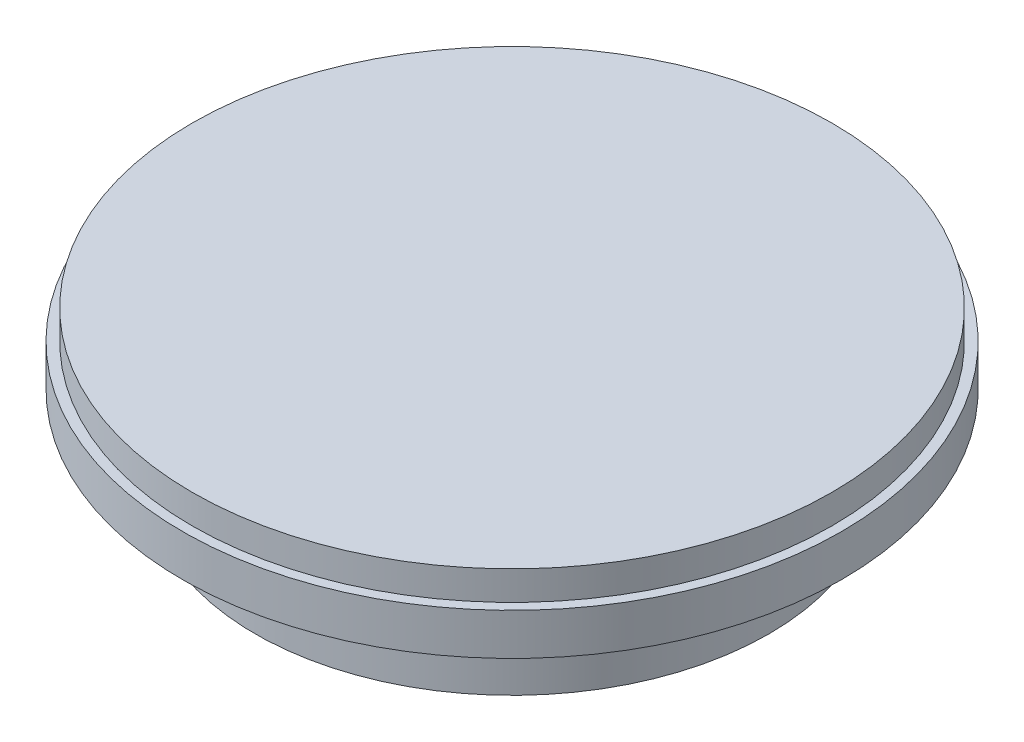
ISO-10303-21;
HEADER;
FILE_DESCRIPTION(('STEP AP214'),'2;1');
FILE_NAME('part.step','',(''),(''),'','','');
FILE_SCHEMA(('AUTOMOTIVE_DESIGN { 1 0 10303 214 1 1 1 1 }'));
ENDSEC;
DATA;
#1=APPLICATION_CONTEXT('core data for automotive mechanical design processes');
#2=APPLICATION_PROTOCOL_DEFINITION('international standard','automotive_design',2000,#1);
#3=PRODUCT_CONTEXT('',#1,'mechanical');
#4=PRODUCT('Part','Part','',(#3));
#5=PRODUCT_RELATED_PRODUCT_CATEGORY('part','',(#4));
#6=PRODUCT_DEFINITION_FORMATION('','',#4);
#7=PRODUCT_DEFINITION_CONTEXT('part definition',#1,'design');
#8=PRODUCT_DEFINITION('design','',#6,#7);
#9=PRODUCT_DEFINITION_SHAPE('','',#8);
#10=(LENGTH_UNIT() NAMED_UNIT(*) SI_UNIT(.MILLI.,.METRE.));
#11=(NAMED_UNIT(*) PLANE_ANGLE_UNIT() SI_UNIT($,.RADIAN.));
#12=(NAMED_UNIT(*) SI_UNIT($,.STERADIAN.) SOLID_ANGLE_UNIT());
#13=UNCERTAINTY_MEASURE_WITH_UNIT(LENGTH_MEASURE(1.E-05),#10,'distance_accuracy_value','');
#14=(GEOMETRIC_REPRESENTATION_CONTEXT(3) GLOBAL_UNCERTAINTY_ASSIGNED_CONTEXT((#13)) GLOBAL_UNIT_ASSIGNED_CONTEXT((#10,
#11,#12)) REPRESENTATION_CONTEXT('',''));
#15=CARTESIAN_POINT('',(0.,0.,0.));
#16=DIRECTION('',(0.,0.,1.));
#17=DIRECTION('',(1.,0.,0.));
#18=AXIS2_PLACEMENT_3D('',#15,#16,#17);
#19=CARTESIAN_POINT('',(0.,-0.849999999999997,0.));
#20=DIRECTION('',(0.,1.,0.));
#21=DIRECTION('',(-1.,0.,0.));
#22=AXIS2_PLACEMENT_3D('',#19,#20,#21);
#23=CONICAL_SURFACE('',#22,26.5,1.19028994968253);
#24=CARTESIAN_POINT('',(0.,2.15,0.));
#25=DIRECTION('',(0.,-1.,0.));
#26=DIRECTION('',(1.,0.,0.));
#27=AXIS2_PLACEMENT_3D('',#24,#25,#26);
#28=CIRCLE('',#27,34.);
#29=CARTESIAN_POINT('',(34.,2.15,0.));
#30=VERTEX_POINT('',#29);
#31=EDGE_CURVE('E41',#30,#30,#28,.T.);
#32=ORIENTED_EDGE('',*,*,#31,.T.);
#33=EDGE_LOOP('',(#32));
#34=FACE_BOUND('',#33,.T.);
#35=CARTESIAN_POINT('',(0.,-0.849999999999997,0.));
#36=DIRECTION('',(0.,-1.,0.));
#37=DIRECTION('',(1.,0.,0.));
#38=AXIS2_PLACEMENT_3D('',#35,#36,#37);
#39=CIRCLE('',#38,26.5);
#40=CARTESIAN_POINT('',(26.5,-0.849999999999999,0.));
#41=VERTEX_POINT('',#40);
#42=EDGE_CURVE('E94',#41,#41,#39,.T.);
#43=ORIENTED_EDGE('',*,*,#42,.F.);
#44=EDGE_LOOP('',(#43));
#45=FACE_BOUND('',#44,.T.);
#46=ADVANCED_FACE('F38',(#34,#45),#23,.T.);
#47=CARTESIAN_POINT('',(0.,-6.45,0.));
#48=DIRECTION('',(0.,-1.,0.));
#49=DIRECTION('',(1.,0.,0.));
#50=AXIS2_PLACEMENT_3D('',#47,#48,#49);
#51=CYLINDRICAL_SURFACE('',#50,34.);
#52=CARTESIAN_POINT('',(0.,6.45,0.));
#53=DIRECTION('',(0.,-1.,0.));
#54=DIRECTION('',(1.,0.,0.));
#55=AXIS2_PLACEMENT_3D('',#52,#53,#54);
#56=CIRCLE('',#55,34.);
#57=CARTESIAN_POINT('',(34.,6.45,0.));
#58=VERTEX_POINT('',#57);
#59=EDGE_CURVE('E100',#58,#58,#56,.T.);
#60=ORIENTED_EDGE('',*,*,#59,.T.);
#61=EDGE_LOOP('',(#60));
#62=FACE_BOUND('',#61,.T.);
#63=ORIENTED_EDGE('',*,*,#31,.F.);
#64=EDGE_LOOP('',(#63));
#65=FACE_BOUND('',#64,.T.);
#66=ADVANCED_FACE('F109',(#62,#65),#51,.T.);
#67=CARTESIAN_POINT('',(0.,6.45,0.));
#68=DIRECTION('',(0.,1.,0.));
#69=DIRECTION('',(-1.,0.,0.));
#70=AXIS2_PLACEMENT_3D('',#67,#68,#69);
#71=PLANE('',#70);
#72=CARTESIAN_POINT('',(0.,6.45,0.));
#73=DIRECTION('',(0.,1.,0.));
#74=DIRECTION('',(-1.,0.,0.));
#75=AXIS2_PLACEMENT_3D('',#72,#73,#74);
#76=CIRCLE('',#75,33.);
#77=CARTESIAN_POINT('',(-33.,6.45000000000001,0.));
#78=VERTEX_POINT('',#77);
#79=EDGE_CURVE('E11',#78,#78,#76,.T.);
#80=ORIENTED_EDGE('',*,*,#79,.F.);
#81=EDGE_LOOP('',(#80));
#82=FACE_BOUND('',#81,.T.);
#83=ORIENTED_EDGE('',*,*,#59,.F.);
#84=EDGE_LOOP('',(#83));
#85=FACE_BOUND('',#84,.T.);
#86=ADVANCED_FACE('F111',(#82,#85),#71,.T.);
#87=CARTESIAN_POINT('',(0.,-6.45,0.));
#88=DIRECTION('',(0.,-1.,0.));
#89=DIRECTION('',(1.,0.,0.));
#90=AXIS2_PLACEMENT_3D('',#87,#88,#89);
#91=PLANE('',#90);
#92=CARTESIAN_POINT('',(-10.6066017177982,-6.45,10.6066017177982));
#93=DIRECTION('',(0.,-1.,0.));
#94=DIRECTION('',(0.,0.,-1.));
#95=AXIS2_PLACEMENT_3D('',#92,#93,#94);
#96=CIRCLE('',#95,1.24999999999999);
#97=CARTESIAN_POINT('',(-10.6066017177982,-6.45,9.35660171779824));
#98=VERTEX_POINT('',#97);
#99=EDGE_CURVE('E70',#98,#98,#96,.T.);
#100=ORIENTED_EDGE('',*,*,#99,.F.);
#101=EDGE_LOOP('',(#100));
#102=FACE_BOUND('',#101,.T.);
#103=CARTESIAN_POINT('',(10.6066017177982,-6.45,10.6066017177982));
#104=DIRECTION('',(0.,-1.,0.));
#105=DIRECTION('',(0.,0.,-1.));
#106=AXIS2_PLACEMENT_3D('',#103,#104,#105);
#107=CIRCLE('',#106,1.24999999999999);
#108=CARTESIAN_POINT('',(10.6066017177982,-6.45,9.3566017177982));
#109=VERTEX_POINT('',#108);
#110=EDGE_CURVE('E69',#109,#109,#107,.T.);
#111=ORIENTED_EDGE('',*,*,#110,.F.);
#112=EDGE_LOOP('',(#111));
#113=FACE_BOUND('',#112,.T.);
#114=CARTESIAN_POINT('',(10.6066017177982,-6.45,-10.6066017177982));
#115=DIRECTION('',(0.,-1.,0.));
#116=DIRECTION('',(0.,0.,-1.));
#117=AXIS2_PLACEMENT_3D('',#114,#115,#116);
#118=CIRCLE('',#117,1.24999999999999);
#119=CARTESIAN_POINT('',(10.6066017177982,-6.45,-11.8566017177982));
#120=VERTEX_POINT('',#119);
#121=EDGE_CURVE('E80',#120,#120,#118,.T.);
#122=ORIENTED_EDGE('',*,*,#121,.F.);
#123=EDGE_LOOP('',(#122));
#124=FACE_BOUND('',#123,.T.);
#125=CARTESIAN_POINT('',(-10.6066017177982,-6.45,-10.6066017177982));
#126=DIRECTION('',(0.,-1.,0.));
#127=DIRECTION('',(0.,0.,-1.));
#128=AXIS2_PLACEMENT_3D('',#125,#126,#127);
#129=CIRCLE('',#128,1.24999999999999);
#130=CARTESIAN_POINT('',(-10.6066017177982,-6.45,-11.8566017177982));
#131=VERTEX_POINT('',#130);
#132=EDGE_CURVE('E86',#131,#131,#129,.T.);
#133=ORIENTED_EDGE('',*,*,#132,.F.);
#134=EDGE_LOOP('',(#133));
#135=FACE_BOUND('',#134,.T.);
#136=CARTESIAN_POINT('',(0.,-6.45,0.));
#137=DIRECTION('',(0.,-1.,0.));
#138=DIRECTION('',(1.,0.,0.));
#139=AXIS2_PLACEMENT_3D('',#136,#137,#138);
#140=CIRCLE('',#139,26.5);
#141=CARTESIAN_POINT('',(26.5,-6.45,0.));
#142=VERTEX_POINT('',#141);
#143=EDGE_CURVE('E98',#142,#142,#140,.T.);
#144=ORIENTED_EDGE('',*,*,#143,.T.);
#145=EDGE_LOOP('',(#144));
#146=FACE_BOUND('',#145,.T.);
#147=ADVANCED_FACE('F116',(#102,#113,#124,#135,#146),#91,.T.);
#148=CARTESIAN_POINT('',(0.,-6.45,0.));
#149=DIRECTION('',(0.,-1.,0.));
#150=DIRECTION('',(1.,0.,0.));
#151=AXIS2_PLACEMENT_3D('',#148,#149,#150);
#152=CYLINDRICAL_SURFACE('',#151,26.5);
#153=ORIENTED_EDGE('',*,*,#42,.T.);
#154=EDGE_LOOP('',(#153));
#155=FACE_BOUND('',#154,.T.);
#156=ORIENTED_EDGE('',*,*,#143,.F.);
#157=EDGE_LOOP('',(#156));
#158=FACE_BOUND('',#157,.T.);
#159=ADVANCED_FACE('F122',(#155,#158),#152,.T.);
#160=CARTESIAN_POINT('',(0.,9.45,0.));
#161=DIRECTION('',(0.,-1.,0.));
#162=DIRECTION('',(1.,0.,0.));
#163=AXIS2_PLACEMENT_3D('',#160,#161,#162);
#164=CYLINDRICAL_SURFACE('',#163,33.);
#165=CARTESIAN_POINT('',(0.,9.45,0.));
#166=DIRECTION('',(0.,1.,0.));
#167=DIRECTION('',(-1.,0.,0.));
#168=AXIS2_PLACEMENT_3D('',#165,#166,#167);
#169=CIRCLE('',#168,33.);
#170=CARTESIAN_POINT('',(-33.,9.45,0.));
#171=VERTEX_POINT('',#170);
#172=EDGE_CURVE('E92',#171,#171,#169,.T.);
#173=ORIENTED_EDGE('',*,*,#172,.F.);
#174=EDGE_LOOP('',(#173));
#175=FACE_BOUND('',#174,.T.);
#176=ORIENTED_EDGE('',*,*,#79,.T.);
#177=EDGE_LOOP('',(#176));
#178=FACE_BOUND('',#177,.T.);
#179=ADVANCED_FACE('F126',(#175,#178),#164,.T.);
#180=CARTESIAN_POINT('',(0.,9.45,0.));
#181=DIRECTION('',(0.,1.,0.));
#182=DIRECTION('',(-1.,0.,0.));
#183=AXIS2_PLACEMENT_3D('',#180,#181,#182);
#184=PLANE('',#183);
#185=ORIENTED_EDGE('',*,*,#172,.T.);
#186=EDGE_LOOP('',(#185));
#187=FACE_BOUND('',#186,.T.);
#188=ADVANCED_FACE('F130',(#187),#184,.T.);
#189=CARTESIAN_POINT('',(-10.6066017177982,1.05,-10.6066017177982));
#190=DIRECTION('',(0.,-1.,0.));
#191=DIRECTION('',(0.,0.,-1.));
#192=AXIS2_PLACEMENT_3D('',#189,#190,#191);
#193=CONICAL_SURFACE('',#192,1.24999999999999,1.02974425867664);
#194=CARTESIAN_POINT('',(-10.6066017177982,1.80107577378445,-10.6066017177982));
#195=VERTEX_POINT('',#194);
#196=VERTEX_LOOP('',#195);
#197=FACE_BOUND('',#196,.T.);
#198=CARTESIAN_POINT('',(-10.6066017177982,1.05,-10.6066017177982));
#199=DIRECTION('',(0.,-1.,0.));
#200=DIRECTION('',(0.,0.,-1.));
#201=AXIS2_PLACEMENT_3D('',#198,#199,#200);
#202=CIRCLE('',#201,1.24999999999999);
#203=CARTESIAN_POINT('',(-10.6066017177982,1.05,-11.8566017177982));
#204=VERTEX_POINT('',#203);
#205=EDGE_CURVE('E89',#204,#204,#202,.T.);
#206=ORIENTED_EDGE('',*,*,#205,.T.);
#207=EDGE_LOOP('',(#206));
#208=FACE_BOUND('',#207,.T.);
#209=ADVANCED_FACE('F134',(#197,#208),#193,.F.);
#210=CARTESIAN_POINT('',(-10.6066017177982,-6.45,-10.6066017177982));
#211=DIRECTION('',(0.,-1.,0.));
#212=DIRECTION('',(0.,0.,-1.));
#213=AXIS2_PLACEMENT_3D('',#210,#211,#212);
#214=CYLINDRICAL_SURFACE('',#213,1.24999999999999);
#215=ORIENTED_EDGE('',*,*,#205,.F.);
#216=EDGE_LOOP('',(#215));
#217=FACE_BOUND('',#216,.T.);
#218=ORIENTED_EDGE('',*,*,#132,.T.);
#219=EDGE_LOOP('',(#218));
#220=FACE_BOUND('',#219,.T.);
#221=ADVANCED_FACE('F138',(#217,#220),#214,.F.);
#222=CARTESIAN_POINT('',(10.6066017177982,1.04999999999999,-10.6066017177982));
#223=DIRECTION('',(0.,-1.,0.));
#224=DIRECTION('',(0.,0.,-1.));
#225=AXIS2_PLACEMENT_3D('',#222,#223,#224);
#226=CONICAL_SURFACE('',#225,1.24999999999999,1.02974425867664);
#227=CARTESIAN_POINT('',(10.6066017177982,1.80107577378445,-10.6066017177982));
#228=VERTEX_POINT('',#227);
#229=VERTEX_LOOP('',#228);
#230=FACE_BOUND('',#229,.T.);
#231=CARTESIAN_POINT('',(10.6066017177982,1.04999999999999,-10.6066017177982));
#232=DIRECTION('',(0.,-1.,0.));
#233=DIRECTION('',(0.,0.,-1.));
#234=AXIS2_PLACEMENT_3D('',#231,#232,#233);
#235=CIRCLE('',#234,1.24999999999999);
#236=CARTESIAN_POINT('',(10.6066017177982,1.04999999999999,-11.8566017177982));
#237=VERTEX_POINT('',#236);
#238=EDGE_CURVE('E83',#237,#237,#235,.T.);
#239=ORIENTED_EDGE('',*,*,#238,.T.);
#240=EDGE_LOOP('',(#239));
#241=FACE_BOUND('',#240,.T.);
#242=ADVANCED_FACE('F141',(#230,#241),#226,.F.);
#243=CARTESIAN_POINT('',(10.6066017177982,-6.45,-10.6066017177982));
#244=DIRECTION('',(0.,-1.,0.));
#245=DIRECTION('',(0.,0.,-1.));
#246=AXIS2_PLACEMENT_3D('',#243,#244,#245);
#247=CYLINDRICAL_SURFACE('',#246,1.24999999999999);
#248=ORIENTED_EDGE('',*,*,#238,.F.);
#249=EDGE_LOOP('',(#248));
#250=FACE_BOUND('',#249,.T.);
#251=ORIENTED_EDGE('',*,*,#121,.T.);
#252=EDGE_LOOP('',(#251));
#253=FACE_BOUND('',#252,.T.);
#254=ADVANCED_FACE('F145',(#250,#253),#247,.F.);
#255=CARTESIAN_POINT('',(10.6066017177982,1.04999999999999,10.6066017177982));
#256=DIRECTION('',(0.,-1.,0.));
#257=DIRECTION('',(0.,0.,-1.));
#258=AXIS2_PLACEMENT_3D('',#255,#256,#257);
#259=CONICAL_SURFACE('',#258,1.24999999999999,1.02974425867664);
#260=CARTESIAN_POINT('',(10.6066017177982,1.80107577378445,10.6066017177982));
#261=VERTEX_POINT('',#260);
#262=VERTEX_LOOP('',#261);
#263=FACE_BOUND('',#262,.T.);
#264=CARTESIAN_POINT('',(10.6066017177982,1.04999999999999,10.6066017177982));
#265=DIRECTION('',(0.,-1.,0.));
#266=DIRECTION('',(0.,0.,-1.));
#267=AXIS2_PLACEMENT_3D('',#264,#265,#266);
#268=CIRCLE('',#267,1.24999999999999);
#269=CARTESIAN_POINT('',(10.6066017177982,1.04999999999999,9.3566017177982));
#270=VERTEX_POINT('',#269);
#271=EDGE_CURVE('E73',#270,#270,#268,.T.);
#272=ORIENTED_EDGE('',*,*,#271,.T.);
#273=EDGE_LOOP('',(#272));
#274=FACE_BOUND('',#273,.T.);
#275=ADVANCED_FACE('F148',(#263,#274),#259,.F.);
#276=CARTESIAN_POINT('',(10.6066017177982,-6.45,10.6066017177982));
#277=DIRECTION('',(0.,-1.,0.));
#278=DIRECTION('',(0.,0.,-1.));
#279=AXIS2_PLACEMENT_3D('',#276,#277,#278);
#280=CYLINDRICAL_SURFACE('',#279,1.24999999999999);
#281=ORIENTED_EDGE('',*,*,#271,.F.);
#282=EDGE_LOOP('',(#281));
#283=FACE_BOUND('',#282,.T.);
#284=ORIENTED_EDGE('',*,*,#110,.T.);
#285=EDGE_LOOP('',(#284));
#286=FACE_BOUND('',#285,.T.);
#287=ADVANCED_FACE('F63',(#283,#286),#280,.F.);
#288=CARTESIAN_POINT('',(-10.6066017177982,1.05,10.6066017177982));
#289=DIRECTION('',(0.,-1.,0.));
#290=DIRECTION('',(0.,0.,-1.));
#291=AXIS2_PLACEMENT_3D('',#288,#289,#290);
#292=CONICAL_SURFACE('',#291,1.24999999999999,1.02974425867664);
#293=CARTESIAN_POINT('',(-10.6066017177982,1.80107577378445,10.6066017177982));
#294=VERTEX_POINT('',#293);
#295=VERTEX_LOOP('',#294);
#296=FACE_BOUND('',#295,.T.);
#297=CARTESIAN_POINT('',(-10.6066017177982,1.05,10.6066017177982));
#298=DIRECTION('',(0.,-1.,0.));
#299=DIRECTION('',(0.,0.,-1.));
#300=AXIS2_PLACEMENT_3D('',#297,#298,#299);
#301=CIRCLE('',#300,1.24999999999999);
#302=CARTESIAN_POINT('',(-10.6066017177982,1.05,9.35660171779824));
#303=VERTEX_POINT('',#302);
#304=EDGE_CURVE('E67',#303,#303,#301,.T.);
#305=ORIENTED_EDGE('',*,*,#304,.T.);
#306=EDGE_LOOP('',(#305));
#307=FACE_BOUND('',#306,.T.);
#308=ADVANCED_FACE('F59',(#296,#307),#292,.F.);
#309=CARTESIAN_POINT('',(-10.6066017177982,-6.45,10.6066017177982));
#310=DIRECTION('',(0.,-1.,0.));
#311=DIRECTION('',(0.,0.,-1.));
#312=AXIS2_PLACEMENT_3D('',#309,#310,#311);
#313=CYLINDRICAL_SURFACE('',#312,1.24999999999999);
#314=ORIENTED_EDGE('',*,*,#304,.F.);
#315=EDGE_LOOP('',(#314));
#316=FACE_BOUND('',#315,.T.);
#317=ORIENTED_EDGE('',*,*,#99,.T.);
#318=EDGE_LOOP('',(#317));
#319=FACE_BOUND('',#318,.T.);
#320=ADVANCED_FACE('F62',(#316,#319),#313,.F.);
#321=CLOSED_SHELL('',(#46,#66,#86,#147,#159,#179,#188,#209,#221,#242,#254,#275,#287,#308,#320));
#322=MANIFOLD_SOLID_BREP('B2',#321);
#323=ADVANCED_BREP_SHAPE_REPRESENTATION('',(#18,#322),#14);
#324=SHAPE_DEFINITION_REPRESENTATION(#9,#323);
ENDSEC;
END-ISO-10303-21;
